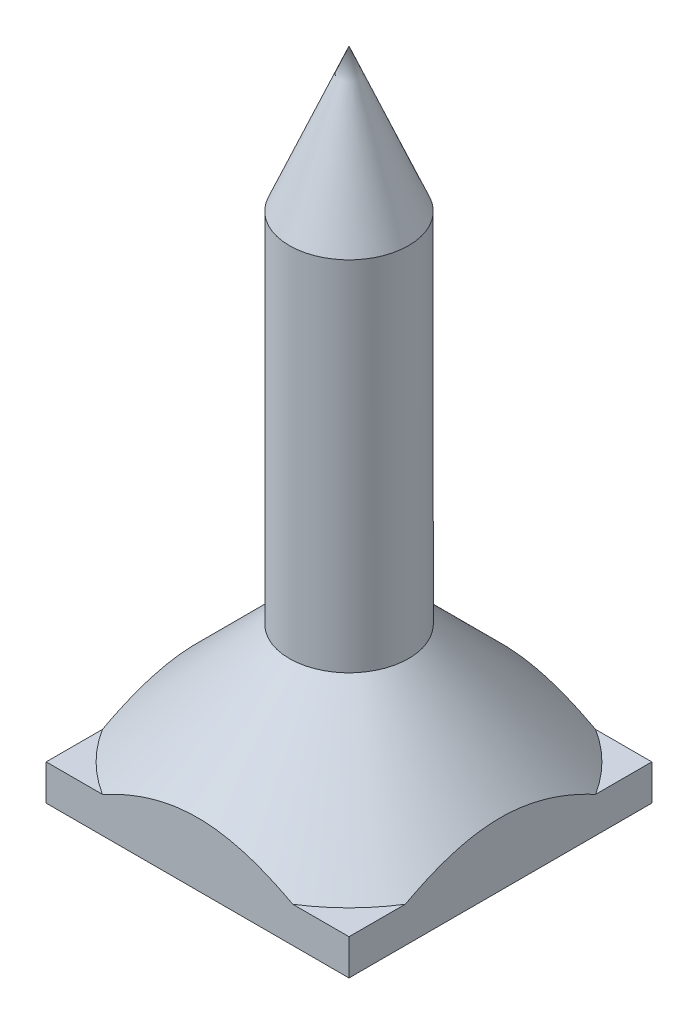
ISO-10303-21;
HEADER;
FILE_DESCRIPTION(('STEP AP214'),'2;1');
FILE_NAME('part.step','',(''),(''),'','','');
FILE_SCHEMA(('AUTOMOTIVE_DESIGN { 1 0 10303 214 1 1 1 1 }'));
ENDSEC;
DATA;
#1=APPLICATION_CONTEXT('core data for automotive mechanical design processes');
#2=APPLICATION_PROTOCOL_DEFINITION('international standard','automotive_design',2000,#1);
#3=PRODUCT_CONTEXT('',#1,'mechanical');
#4=PRODUCT('Part','Part','',(#3));
#5=PRODUCT_RELATED_PRODUCT_CATEGORY('part','',(#4));
#6=PRODUCT_DEFINITION_FORMATION('','',#4);
#7=PRODUCT_DEFINITION_CONTEXT('part definition',#1,'design');
#8=PRODUCT_DEFINITION('design','',#6,#7);
#9=PRODUCT_DEFINITION_SHAPE('','',#8);
#10=(LENGTH_UNIT() NAMED_UNIT(*) SI_UNIT(.MILLI.,.METRE.));
#11=(NAMED_UNIT(*) PLANE_ANGLE_UNIT() SI_UNIT($,.RADIAN.));
#12=(NAMED_UNIT(*) SI_UNIT($,.STERADIAN.) SOLID_ANGLE_UNIT());
#13=UNCERTAINTY_MEASURE_WITH_UNIT(LENGTH_MEASURE(1.E-05),#10,'distance_accuracy_value','');
#14=(GEOMETRIC_REPRESENTATION_CONTEXT(3) GLOBAL_UNCERTAINTY_ASSIGNED_CONTEXT((#13)) GLOBAL_UNIT_ASSIGNED_CONTEXT((#10,
#11,#12)) REPRESENTATION_CONTEXT('',''));
#15=CARTESIAN_POINT('',(0.,0.,0.));
#16=DIRECTION('',(0.,0.,1.));
#17=DIRECTION('',(1.,0.,0.));
#18=AXIS2_PLACEMENT_3D('',#15,#16,#17);
#19=CARTESIAN_POINT('',(0.,3.,0.));
#20=DIRECTION('',(0.,1.,0.));
#21=DIRECTION('',(0.,0.,1.));
#22=AXIS2_PLACEMENT_3D('',#19,#20,#21);
#23=PLANE('',#22);
#24=DIRECTION('',(0.,0.,1.));
#25=VECTOR('',#24,1.);
#26=CARTESIAN_POINT('',(-12.7,3.,-12.7));
#27=LINE('',#26,#25);
#28=CARTESIAN_POINT('',(-12.7,3.,-12.7));
#29=VERTEX_POINT('',#28);
#30=CARTESIAN_POINT('',(-12.7,3.,-7.98185442112309));
#31=VERTEX_POINT('',#30);
#32=EDGE_CURVE('E128',#29,#31,#27,.T.);
#33=ORIENTED_EDGE('',*,*,#32,.T.);
#34=CARTESIAN_POINT('',(0.,3.,0.));
#35=DIRECTION('',(0.,1.,0.));
#36=DIRECTION('',(0.,0.,1.));
#37=AXIS2_PLACEMENT_3D('',#34,#35,#36);
#38=CIRCLE('',#37,15.0000000000001);
#39=CARTESIAN_POINT('',(-7.98185442112309,3.,-12.7));
#40=VERTEX_POINT('',#39);
#41=EDGE_CURVE('E159',#31,#40,#38,.F.);
#42=ORIENTED_EDGE('',*,*,#41,.T.);
#43=DIRECTION('',(-1.,0.,0.));
#44=VECTOR('',#43,1.);
#45=CARTESIAN_POINT('',(-12.7,3.,-12.7));
#46=LINE('',#45,#44);
#47=EDGE_CURVE('E122',#40,#29,#46,.T.);
#48=ORIENTED_EDGE('',*,*,#47,.T.);
#49=EDGE_LOOP('',(#33,#42,#48));
#50=FACE_BOUND('',#49,.T.);
#51=ADVANCED_FACE('F35',(#50),#23,.T.);
#52=CARTESIAN_POINT('',(12.7,3.,-12.7));
#53=VERTEX_POINT('',#52);
#54=CARTESIAN_POINT('',(7.98185442112309,3.,-12.7));
#55=VERTEX_POINT('',#54);
#56=EDGE_CURVE('E124',#53,#55,#46,.T.);
#57=ORIENTED_EDGE('',*,*,#56,.T.);
#58=CARTESIAN_POINT('',(0.,3.,0.));
#59=DIRECTION('',(0.,1.,0.));
#60=DIRECTION('',(0.,0.,1.));
#61=AXIS2_PLACEMENT_3D('',#58,#59,#60);
#62=CIRCLE('',#61,15.0000000000001);
#63=CARTESIAN_POINT('',(12.7,3.,-7.98185442112309));
#64=VERTEX_POINT('',#63);
#65=EDGE_CURVE('E157',#55,#64,#62,.F.);
#66=ORIENTED_EDGE('',*,*,#65,.T.);
#67=DIRECTION('',(0.,0.,-1.));
#68=VECTOR('',#67,1.);
#69=CARTESIAN_POINT('',(12.7,3.,-12.7));
#70=LINE('',#69,#68);
#71=EDGE_CURVE('E123',#64,#53,#70,.T.);
#72=ORIENTED_EDGE('',*,*,#71,.T.);
#73=EDGE_LOOP('',(#57,#66,#72));
#74=FACE_BOUND('',#73,.T.);
#75=ADVANCED_FACE('F187',(#74),#23,.T.);
#76=CARTESIAN_POINT('',(12.7,3.,12.7));
#77=VERTEX_POINT('',#76);
#78=CARTESIAN_POINT('',(12.7,3.,7.98185442112309));
#79=VERTEX_POINT('',#78);
#80=EDGE_CURVE('E120',#77,#79,#70,.T.);
#81=ORIENTED_EDGE('',*,*,#80,.T.);
#82=CARTESIAN_POINT('',(0.,3.,0.));
#83=DIRECTION('',(0.,1.,0.));
#84=DIRECTION('',(0.,0.,1.));
#85=AXIS2_PLACEMENT_3D('',#82,#83,#84);
#86=CIRCLE('',#85,15.0000000000001);
#87=CARTESIAN_POINT('',(7.98185442112309,3.,12.7));
#88=VERTEX_POINT('',#87);
#89=EDGE_CURVE('E55',#79,#88,#86,.F.);
#90=ORIENTED_EDGE('',*,*,#89,.T.);
#91=DIRECTION('',(1.,0.,0.));
#92=VECTOR('',#91,1.);
#93=CARTESIAN_POINT('',(-12.7,3.,12.7));
#94=LINE('',#93,#92);
#95=EDGE_CURVE('E131',#88,#77,#94,.T.);
#96=ORIENTED_EDGE('',*,*,#95,.T.);
#97=EDGE_LOOP('',(#81,#90,#96));
#98=FACE_BOUND('',#97,.T.);
#99=ADVANCED_FACE('F182',(#98),#23,.T.);
#100=CARTESIAN_POINT('',(12.7,3.,-12.7));
#101=DIRECTION('',(-1.,0.,0.));
#102=DIRECTION('',(0.,0.,1.));
#103=AXIS2_PLACEMENT_3D('',#100,#101,#102);
#104=PLANE('',#103);
#105=DIRECTION('',(0.,0.,-1.));
#106=VECTOR('',#105,1.);
#107=CARTESIAN_POINT('',(12.7,0.,-12.7));
#108=LINE('',#107,#106);
#109=CARTESIAN_POINT('',(12.7,0.,12.7));
#110=VERTEX_POINT('',#109);
#111=CARTESIAN_POINT('',(12.7,0.,-12.7));
#112=VERTEX_POINT('',#111);
#113=EDGE_CURVE('E114',#110,#112,#108,.T.);
#114=ORIENTED_EDGE('',*,*,#113,.T.);
#115=DIRECTION('',(0.,-1.,0.));
#116=VECTOR('',#115,1.);
#117=CARTESIAN_POINT('',(12.7,3.,-12.7));
#118=LINE('',#117,#116);
#119=EDGE_CURVE('E148',#53,#112,#118,.T.);
#120=ORIENTED_EDGE('',*,*,#119,.F.);
#121=ORIENTED_EDGE('',*,*,#71,.F.);
#122=CARTESIAN_POINT('',(12.7,3.,-7.98185442112309));
#123=CARTESIAN_POINT('',(12.7,3.11879831329429,-7.75857118824416));
#124=CARTESIAN_POINT('',(12.7,3.23484506345829,-7.53380112802549));
#125=CARTESIAN_POINT('',(12.7,3.46065547637041,-7.08104367783081));
#126=CARTESIAN_POINT('',(12.7,3.57041717480403,-6.85305530946519));
#127=CARTESIAN_POINT('',(12.7,3.7832178072983,-6.3928583632601));
#128=CARTESIAN_POINT('',(12.7,3.88622878144904,-6.16063677124377));
#129=CARTESIAN_POINT('',(12.7,4.08407999046722,-5.69278426815837));
#130=CARTESIAN_POINT('',(12.7,4.17892091653303,-5.45715364747205));
#131=CARTESIAN_POINT('',(12.7,4.44859230245895,-4.7477448817082));
#132=CARTESIAN_POINT('',(12.7,4.60990459683797,-4.26862165573885));
#133=CARTESIAN_POINT('',(12.7,4.81773263879016,-3.54064768785785));
#134=CARTESIAN_POINT('',(12.7,4.88129100265066,-3.29658894276989));
#135=CARTESIAN_POINT('',(12.7,4.99598908895255,-2.8055824256638));
#136=CARTESIAN_POINT('',(12.7,5.04713021106923,-2.55863498255287));
#137=CARTESIAN_POINT('',(12.7,5.15862033107284,-1.93565738497596));
#138=CARTESIAN_POINT('',(12.7,5.21035977359975,-1.55803684516446));
#139=CARTESIAN_POINT('',(12.7,5.28045307895187,-0.79963762768062));
#140=CARTESIAN_POINT('',(12.7,5.29880286671081,-0.418858570220703));
#141=CARTESIAN_POINT('',(12.7,5.30108322360992,0.342788427278399));
#142=CARTESIAN_POINT('',(12.7,5.2850152362948,0.723656362919949));
#143=CARTESIAN_POINT('',(12.7,5.21936226932978,1.48241851629438));
#144=CARTESIAN_POINT('',(12.7,5.16978168115449,1.86031311708877));
#145=CARTESIAN_POINT('',(12.7,5.0611738448217,2.48690826118367));
#146=CARTESIAN_POINT('',(12.7,5.01064918014123,2.73713040569948));
#147=CARTESIAN_POINT('',(12.7,4.89678162829121,3.23465048566771));
#148=CARTESIAN_POINT('',(12.7,4.83343735818081,3.4819481025818));
#149=CARTESIAN_POINT('',(12.7,4.62568871144374,4.21959695807999));
#150=CARTESIAN_POINT('',(12.7,4.46368399317063,4.70506814729197));
#151=CARTESIAN_POINT('',(12.7,4.19207197317871,5.42389308709328));
#152=CARTESIAN_POINT('',(12.7,4.09639541647266,5.66272753112357));
#153=CARTESIAN_POINT('',(12.7,3.89662087872883,6.13689687966589));
#154=CARTESIAN_POINT('',(12.7,3.79252215091563,6.37223147165881));
#155=CARTESIAN_POINT('',(12.7,3.57735946998962,6.83850956482992));
#156=CARTESIAN_POINT('',(12.7,3.46632560661092,7.0694670448017));
#157=CARTESIAN_POINT('',(12.7,3.2378001426933,7.5280754952869));
#158=CARTESIAN_POINT('',(12.7,3.12031065229029,7.75572751584861));
#159=CARTESIAN_POINT('',(12.7,3.,7.98185442112309));
#160=B_SPLINE_CURVE_WITH_KNOTS('',3,(#122,#123,#124,#125,#126,#127,#128,#129,#130,#131,#132,
#133,#134,#135,#136,#137,#138,#139,#140,#141,#142,#143,#144,#145,#146,#147,#148,#149,#150,#151,
#152,#153,#154,#155,#156,#157,#158,#159),.UNSPECIFIED.,.F.,.F.,(4,2,2,2,2,2,2,2,2,2,2,2,2,2,2,2,
2,2,4),(0.,0.758768175132974,1.51777221376504,2.27974354303534,3.04165034494515,
4.55610413540643,5.31243480913123,6.06868018941063,7.21067700994502,8.35281319701983,
9.49490148174304,10.6368401367895,11.4023221009698,12.167886687124,13.7009468957227,
14.4727026044539,15.2445268182221,16.0132080396631,16.7816394816877),.UNSPECIFIED.);
#161=EDGE_CURVE('E168',#64,#79,#160,.T.);
#162=ORIENTED_EDGE('',*,*,#161,.T.);
#163=ORIENTED_EDGE('',*,*,#80,.F.);
#164=DIRECTION('',(0.,-1.,0.));
#165=VECTOR('',#164,1.);
#166=CARTESIAN_POINT('',(12.7,3.,12.7));
#167=LINE('',#166,#165);
#168=EDGE_CURVE('E133',#77,#110,#167,.T.);
#169=ORIENTED_EDGE('',*,*,#168,.T.);
#170=EDGE_LOOP('',(#114,#120,#121,#162,#163,#169));
#171=FACE_BOUND('',#170,.T.);
#172=ADVANCED_FACE('F176',(#171),#104,.F.);
#173=CARTESIAN_POINT('',(-12.7,3.,-12.7));
#174=DIRECTION('',(0.,0.,1.));
#175=DIRECTION('',(1.,0.,0.));
#176=AXIS2_PLACEMENT_3D('',#173,#174,#175);
#177=PLANE('',#176);
#178=DIRECTION('',(-1.,0.,0.));
#179=VECTOR('',#178,1.);
#180=CARTESIAN_POINT('',(-12.7,0.,-12.7));
#181=LINE('',#180,#179);
#182=CARTESIAN_POINT('',(-12.7,0.,-12.7));
#183=VERTEX_POINT('',#182);
#184=EDGE_CURVE('E117',#112,#183,#181,.T.);
#185=ORIENTED_EDGE('',*,*,#184,.T.);
#186=DIRECTION('',(0.,-1.,0.));
#187=VECTOR('',#186,1.);
#188=CARTESIAN_POINT('',(-12.7,3.,-12.7));
#189=LINE('',#188,#187);
#190=EDGE_CURVE('E145',#29,#183,#189,.T.);
#191=ORIENTED_EDGE('',*,*,#190,.F.);
#192=ORIENTED_EDGE('',*,*,#47,.F.);
#193=CARTESIAN_POINT('',(-7.98185442112309,3.,-12.7));
#194=CARTESIAN_POINT('',(-7.75857118824416,3.11879831329429,-12.7));
#195=CARTESIAN_POINT('',(-7.53380112802549,3.23484506345829,-12.7));
#196=CARTESIAN_POINT('',(-7.08104367783081,3.46065547637041,-12.7));
#197=CARTESIAN_POINT('',(-6.85305530946519,3.57041717480403,-12.7));
#198=CARTESIAN_POINT('',(-6.3928583632601,3.7832178072983,-12.7));
#199=CARTESIAN_POINT('',(-6.16063677124377,3.88622878144904,-12.7));
#200=CARTESIAN_POINT('',(-5.69278426815837,4.08407999046723,-12.7));
#201=CARTESIAN_POINT('',(-5.45715364747205,4.17892091653303,-12.7));
#202=CARTESIAN_POINT('',(-4.7477448817082,4.44859230245895,-12.7));
#203=CARTESIAN_POINT('',(-4.26862165573885,4.60990459683797,-12.7));
#204=CARTESIAN_POINT('',(-3.54064768785785,4.81773263879016,-12.7));
#205=CARTESIAN_POINT('',(-3.29658894276989,4.88129100265066,-12.7));
#206=CARTESIAN_POINT('',(-2.8055824256638,4.99598908895255,-12.7));
#207=CARTESIAN_POINT('',(-2.55863498255288,5.04713021106923,-12.7));
#208=CARTESIAN_POINT('',(-1.93565738497596,5.15862033107284,-12.7));
#209=CARTESIAN_POINT('',(-1.55803684516447,5.21035977359975,-12.7));
#210=CARTESIAN_POINT('',(-0.799637627680624,5.28045307895187,-12.7));
#211=CARTESIAN_POINT('',(-0.418858570220706,5.29880286671081,-12.7));
#212=CARTESIAN_POINT('',(0.342788427278396,5.30108322360993,-12.7));
#213=CARTESIAN_POINT('',(0.723656362919946,5.28501523629481,-12.7));
#214=CARTESIAN_POINT('',(1.48241851629438,5.21936226932978,-12.7));
#215=CARTESIAN_POINT('',(1.86031311708877,5.16978168115449,-12.7));
#216=CARTESIAN_POINT('',(2.48690826118367,5.0611738448217,-12.7));
#217=CARTESIAN_POINT('',(2.73713040569948,5.01064918014123,-12.7));
#218=CARTESIAN_POINT('',(3.23465048566771,4.89678162829121,-12.7));
#219=CARTESIAN_POINT('',(3.4819481025818,4.83343735818081,-12.7));
#220=CARTESIAN_POINT('',(4.21959695807999,4.62568871144374,-12.7));
#221=CARTESIAN_POINT('',(4.70506814729197,4.46368399317063,-12.7));
#222=CARTESIAN_POINT('',(5.42389308709328,4.19207197317871,-12.7));
#223=CARTESIAN_POINT('',(5.66272753112358,4.09639541647266,-12.7));
#224=CARTESIAN_POINT('',(6.1368968796659,3.89662087872883,-12.7));
#225=CARTESIAN_POINT('',(6.37223147165881,3.79252215091563,-12.7));
#226=CARTESIAN_POINT('',(6.83850956482993,3.57735946998962,-12.7));
#227=CARTESIAN_POINT('',(7.06946704480171,3.46632560661091,-12.7));
#228=CARTESIAN_POINT('',(7.5280754952869,3.2378001426933,-12.7));
#229=CARTESIAN_POINT('',(7.75572751584862,3.12031065229029,-12.7));
#230=CARTESIAN_POINT('',(7.98185442112309,3.,-12.7));
#231=B_SPLINE_CURVE_WITH_KNOTS('',3,(#193,#194,#195,#196,#197,#198,#199,#200,#201,#202,#203,
#204,#205,#206,#207,#208,#209,#210,#211,#212,#213,#214,#215,#216,#217,#218,#219,#220,#221,#222,
#223,#224,#225,#226,#227,#228,#229,#230),.UNSPECIFIED.,.F.,.F.,(4,2,2,2,2,2,2,2,2,2,2,2,2,2,2,2,
2,2,4),(0.,0.758768175132973,1.51777221376504,2.27974354303535,3.04165034494515,
4.55610413540643,5.31243480913123,6.06868018941063,7.21067700994501,8.35281319701983,
9.49490148174304,10.6368401367895,11.4023221009698,12.167886687124,13.7009468957227,
14.4727026044539,15.2445268182221,16.0132080396631,16.7816394816877),.UNSPECIFIED.);
#232=EDGE_CURVE('E162',#40,#55,#231,.T.);
#233=ORIENTED_EDGE('',*,*,#232,.T.);
#234=ORIENTED_EDGE('',*,*,#56,.F.);
#235=ORIENTED_EDGE('',*,*,#119,.T.);
#236=EDGE_LOOP('',(#185,#191,#192,#233,#234,#235));
#237=FACE_BOUND('',#236,.T.);
#238=ADVANCED_FACE('F172',(#237),#177,.F.);
#239=CARTESIAN_POINT('',(-12.7,3.,-12.7));
#240=DIRECTION('',(1.,0.,0.));
#241=DIRECTION('',(0.,0.,-1.));
#242=AXIS2_PLACEMENT_3D('',#239,#240,#241);
#243=PLANE('',#242);
#244=DIRECTION('',(0.,0.,1.));
#245=VECTOR('',#244,1.);
#246=CARTESIAN_POINT('',(-12.7,0.,-12.7));
#247=LINE('',#246,#245);
#248=CARTESIAN_POINT('',(-12.7,0.,12.7));
#249=VERTEX_POINT('',#248);
#250=EDGE_CURVE('E136',#183,#249,#247,.T.);
#251=ORIENTED_EDGE('',*,*,#250,.T.);
#252=DIRECTION('',(0.,-1.,0.));
#253=VECTOR('',#252,1.);
#254=CARTESIAN_POINT('',(-12.7,3.,12.7));
#255=LINE('',#254,#253);
#256=CARTESIAN_POINT('',(-12.7,3.,12.7));
#257=VERTEX_POINT('',#256);
#258=EDGE_CURVE('E142',#257,#249,#255,.T.);
#259=ORIENTED_EDGE('',*,*,#258,.F.);
#260=CARTESIAN_POINT('',(-12.7,3.,7.9818544211231));
#261=VERTEX_POINT('',#260);
#262=EDGE_CURVE('E127',#261,#257,#27,.T.);
#263=ORIENTED_EDGE('',*,*,#262,.F.);
#264=CARTESIAN_POINT('',(-12.7,3.,7.9818544211231));
#265=CARTESIAN_POINT('',(-12.7,3.1187983132943,7.75857118824417));
#266=CARTESIAN_POINT('',(-12.7,3.23484506345829,7.53380112802549));
#267=CARTESIAN_POINT('',(-12.7,3.46065547637041,7.08104367783081));
#268=CARTESIAN_POINT('',(-12.7,3.57041717480403,6.8530553094652));
#269=CARTESIAN_POINT('',(-12.7,3.7832178072983,6.3928583632601));
#270=CARTESIAN_POINT('',(-12.7,3.88622878144904,6.16063677124377));
#271=CARTESIAN_POINT('',(-12.7,4.08407999046723,5.69278426815837));
#272=CARTESIAN_POINT('',(-12.7,4.17892091653304,5.45715364747205));
#273=CARTESIAN_POINT('',(-12.7,4.44859230245895,4.74774488170821));
#274=CARTESIAN_POINT('',(-12.7,4.60990459683797,4.26862165573885));
#275=CARTESIAN_POINT('',(-12.7,4.81773263879017,3.54064768785785));
#276=CARTESIAN_POINT('',(-12.7,4.88129100265066,3.29658894276989));
#277=CARTESIAN_POINT('',(-12.7,4.99598908895255,2.8055824256638));
#278=CARTESIAN_POINT('',(-12.7,5.04713021106923,2.55863498255288));
#279=CARTESIAN_POINT('',(-12.7,5.15862033107284,1.93565738497596));
#280=CARTESIAN_POINT('',(-12.7,5.21035977359975,1.55803684516447));
#281=CARTESIAN_POINT('',(-12.7,5.28045307895187,0.799637627680623));
#282=CARTESIAN_POINT('',(-12.7,5.29880286671081,0.418858570220706));
#283=CARTESIAN_POINT('',(-12.7,5.30108322360993,-0.342788427278395));
#284=CARTESIAN_POINT('',(-12.7,5.28501523629481,-0.723656362919946));
#285=CARTESIAN_POINT('',(-12.7,5.21936226932978,-1.48241851629438));
#286=CARTESIAN_POINT('',(-12.7,5.1697816811545,-1.86031311708877));
#287=CARTESIAN_POINT('',(-12.7,5.06117384482171,-2.48690826118367));
#288=CARTESIAN_POINT('',(-12.7,5.01064918014123,-2.73713040569948));
#289=CARTESIAN_POINT('',(-12.7,4.89678162829121,-3.23465048566771));
#290=CARTESIAN_POINT('',(-12.7,4.83343735818081,-3.4819481025818));
#291=CARTESIAN_POINT('',(-12.7,4.62568871144374,-4.21959695807999));
#292=CARTESIAN_POINT('',(-12.7,4.46368399317063,-4.70506814729197));
#293=CARTESIAN_POINT('',(-12.7,4.19207197317871,-5.42389308709328));
#294=CARTESIAN_POINT('',(-12.7,4.09639541647266,-5.66272753112357));
#295=CARTESIAN_POINT('',(-12.7,3.89662087872883,-6.13689687966589));
#296=CARTESIAN_POINT('',(-12.7,3.79252215091563,-6.37223147165881));
#297=CARTESIAN_POINT('',(-12.7,3.57735946998962,-6.83850956482993));
#298=CARTESIAN_POINT('',(-12.7,3.46632560661092,-7.06946704480171));
#299=CARTESIAN_POINT('',(-12.7,3.2378001426933,-7.5280754952869));
#300=CARTESIAN_POINT('',(-12.7,3.12031065229029,-7.75572751584862));
#301=CARTESIAN_POINT('',(-12.7,3.,-7.98185442112309));
#302=B_SPLINE_CURVE_WITH_KNOTS('',3,(#264,#265,#266,#267,#268,#269,#270,#271,#272,#273,#274,
#275,#276,#277,#278,#279,#280,#281,#282,#283,#284,#285,#286,#287,#288,#289,#290,#291,#292,#293,
#294,#295,#296,#297,#298,#299,#300,#301),.UNSPECIFIED.,.F.,.F.,(4,2,2,2,2,2,2,2,2,2,2,2,2,2,2,2,
2,2,4),(0.,0.758768175132974,1.51777221376504,2.27974354303535,3.04165034494515,
4.55610413540643,5.31243480913124,6.06868018941063,7.21067700994502,8.35281319701983,
9.49490148174304,10.6368401367895,11.4023221009698,12.167886687124,13.7009468957227,
14.4727026044539,15.2445268182221,16.0132080396631,16.7816394816877),.UNSPECIFIED.);
#303=EDGE_CURVE('E11',#261,#31,#302,.T.);
#304=ORIENTED_EDGE('',*,*,#303,.T.);
#305=ORIENTED_EDGE('',*,*,#32,.F.);
#306=ORIENTED_EDGE('',*,*,#190,.T.);
#307=EDGE_LOOP('',(#251,#259,#263,#304,#305,#306));
#308=FACE_BOUND('',#307,.T.);
#309=ADVANCED_FACE('F175',(#308),#243,.F.);
#310=CARTESIAN_POINT('',(-12.7,3.,12.7));
#311=DIRECTION('',(0.,0.,-1.));
#312=DIRECTION('',(-1.,0.,0.));
#313=AXIS2_PLACEMENT_3D('',#310,#311,#312);
#314=PLANE('',#313);
#315=DIRECTION('',(1.,0.,0.));
#316=VECTOR('',#315,1.);
#317=CARTESIAN_POINT('',(-12.7,0.,12.7));
#318=LINE('',#317,#316);
#319=EDGE_CURVE('E138',#249,#110,#318,.T.);
#320=ORIENTED_EDGE('',*,*,#319,.T.);
#321=ORIENTED_EDGE('',*,*,#168,.F.);
#322=ORIENTED_EDGE('',*,*,#95,.F.);
#323=CARTESIAN_POINT('',(7.98185442112309,3.,12.7));
#324=CARTESIAN_POINT('',(7.75857118824416,3.11879831329429,12.7));
#325=CARTESIAN_POINT('',(7.53380112802549,3.23484506345829,12.7));
#326=CARTESIAN_POINT('',(7.08104367783081,3.46065547637041,12.7));
#327=CARTESIAN_POINT('',(6.85305530946519,3.57041717480403,12.7));
#328=CARTESIAN_POINT('',(6.3928583632601,3.7832178072983,12.7));
#329=CARTESIAN_POINT('',(6.16063677124377,3.88622878144904,12.7));
#330=CARTESIAN_POINT('',(5.69278426815837,4.08407999046723,12.7));
#331=CARTESIAN_POINT('',(5.45715364747205,4.17892091653303,12.7));
#332=CARTESIAN_POINT('',(4.7477448817082,4.44859230245895,12.7));
#333=CARTESIAN_POINT('',(4.26862165573885,4.60990459683797,12.7));
#334=CARTESIAN_POINT('',(3.54064768785785,4.81773263879016,12.7));
#335=CARTESIAN_POINT('',(3.29658894276989,4.88129100265066,12.7));
#336=CARTESIAN_POINT('',(2.8055824256638,4.99598908895255,12.7));
#337=CARTESIAN_POINT('',(2.55863498255288,5.04713021106923,12.7));
#338=CARTESIAN_POINT('',(1.93565738497596,5.15862033107284,12.7));
#339=CARTESIAN_POINT('',(1.55803684516447,5.21035977359975,12.7));
#340=CARTESIAN_POINT('',(0.799637627680624,5.28045307895187,12.7));
#341=CARTESIAN_POINT('',(0.418858570220706,5.29880286671081,12.7));
#342=CARTESIAN_POINT('',(-0.342788427278396,5.30108322360993,12.7));
#343=CARTESIAN_POINT('',(-0.723656362919946,5.28501523629481,12.7));
#344=CARTESIAN_POINT('',(-1.48241851629438,5.21936226932978,12.7));
#345=CARTESIAN_POINT('',(-1.86031311708877,5.16978168115449,12.7));
#346=CARTESIAN_POINT('',(-2.48690826118367,5.0611738448217,12.7));
#347=CARTESIAN_POINT('',(-2.73713040569948,5.01064918014123,12.7));
#348=CARTESIAN_POINT('',(-3.23465048566771,4.89678162829121,12.7));
#349=CARTESIAN_POINT('',(-3.4819481025818,4.83343735818081,12.7));
#350=CARTESIAN_POINT('',(-4.21959695807999,4.62568871144374,12.7));
#351=CARTESIAN_POINT('',(-4.70506814729197,4.46368399317063,12.7));
#352=CARTESIAN_POINT('',(-5.42389308709328,4.19207197317871,12.7));
#353=CARTESIAN_POINT('',(-5.66272753112358,4.09639541647266,12.7));
#354=CARTESIAN_POINT('',(-6.1368968796659,3.89662087872883,12.7));
#355=CARTESIAN_POINT('',(-6.37223147165881,3.79252215091563,12.7));
#356=CARTESIAN_POINT('',(-6.83850956482993,3.57735946998962,12.7));
#357=CARTESIAN_POINT('',(-7.06946704480171,3.46632560661091,12.7));
#358=CARTESIAN_POINT('',(-7.5280754952869,3.2378001426933,12.7));
#359=CARTESIAN_POINT('',(-7.75572751584862,3.12031065229029,12.7));
#360=CARTESIAN_POINT('',(-7.98185442112309,3.,12.7));
#361=B_SPLINE_CURVE_WITH_KNOTS('',3,(#323,#324,#325,#326,#327,#328,#329,#330,#331,#332,#333,
#334,#335,#336,#337,#338,#339,#340,#341,#342,#343,#344,#345,#346,#347,#348,#349,#350,#351,#352,
#353,#354,#355,#356,#357,#358,#359,#360),.UNSPECIFIED.,.F.,.F.,(4,2,2,2,2,2,2,2,2,2,2,2,2,2,2,2,
2,2,4),(0.,0.758768175132973,1.51777221376504,2.27974354303535,3.04165034494515,
4.55610413540643,5.31243480913123,6.06868018941063,7.21067700994501,8.35281319701983,
9.49490148174304,10.6368401367895,11.4023221009698,12.167886687124,13.7009468957227,
14.4727026044539,15.2445268182221,16.0132080396631,16.7816394816877),.UNSPECIFIED.);
#362=CARTESIAN_POINT('',(-7.98185442112309,3.,12.7));
#363=VERTEX_POINT('',#362);
#364=EDGE_CURVE('E48',#88,#363,#361,.T.);
#365=ORIENTED_EDGE('',*,*,#364,.T.);
#366=EDGE_CURVE('E132',#257,#363,#94,.T.);
#367=ORIENTED_EDGE('',*,*,#366,.F.);
#368=ORIENTED_EDGE('',*,*,#258,.T.);
#369=EDGE_LOOP('',(#320,#321,#322,#365,#367,#368));
#370=FACE_BOUND('',#369,.T.);
#371=ADVANCED_FACE('F200',(#370),#314,.F.);
#372=ORIENTED_EDGE('',*,*,#366,.T.);
#373=CARTESIAN_POINT('',(0.,3.,0.));
#374=DIRECTION('',(0.,1.,0.));
#375=DIRECTION('',(0.,0.,1.));
#376=AXIS2_PLACEMENT_3D('',#373,#374,#375);
#377=CIRCLE('',#376,15.0000000000001);
#378=EDGE_CURVE('E154',#363,#261,#377,.F.);
#379=ORIENTED_EDGE('',*,*,#378,.T.);
#380=ORIENTED_EDGE('',*,*,#262,.T.);
#381=EDGE_LOOP('',(#372,#379,#380));
#382=FACE_BOUND('',#381,.T.);
#383=ADVANCED_FACE('F189',(#382),#23,.T.);
#384=CARTESIAN_POINT('',(0.,0.,0.));
#385=DIRECTION('',(0.,1.,0.));
#386=DIRECTION('',(0.,0.,1.));
#387=AXIS2_PLACEMENT_3D('',#384,#385,#386);
#388=PLANE('',#387);
#389=ORIENTED_EDGE('',*,*,#113,.F.);
#390=ORIENTED_EDGE('',*,*,#319,.F.);
#391=ORIENTED_EDGE('',*,*,#250,.F.);
#392=ORIENTED_EDGE('',*,*,#184,.F.);
#393=EDGE_LOOP('',(#389,#390,#391,#392));
#394=FACE_BOUND('',#393,.T.);
#395=ADVANCED_FACE('F199',(#394),#388,.F.);
#396=CARTESIAN_POINT('',(0.,43.,0.));
#397=DIRECTION('',(0.,-1.,0.));
#398=DIRECTION('',(0.,0.,-1.));
#399=AXIS2_PLACEMENT_3D('',#396,#397,#398);
#400=CYLINDRICAL_SURFACE('',#399,5.);
#401=CARTESIAN_POINT('',(0.,13.0000000000002,0.));
#402=DIRECTION('',(0.,1.,0.));
#403=DIRECTION('',(0.,0.,1.));
#404=AXIS2_PLACEMENT_3D('',#401,#402,#403);
#405=CIRCLE('',#404,5.);
#406=CARTESIAN_POINT('',(0.,13.0000000000002,5.));
#407=VERTEX_POINT('',#406);
#408=EDGE_CURVE('E151',#407,#407,#405,.T.);
#409=ORIENTED_EDGE('',*,*,#408,.T.);
#410=EDGE_LOOP('',(#409));
#411=FACE_BOUND('',#410,.T.);
#412=CARTESIAN_POINT('',(0.,43.,0.));
#413=DIRECTION('',(0.,1.,0.));
#414=DIRECTION('',(0.,0.,1.));
#415=AXIS2_PLACEMENT_3D('',#412,#413,#414);
#416=CIRCLE('',#415,5.);
#417=CARTESIAN_POINT('',(0.,43.,5.));
#418=VERTEX_POINT('',#417);
#419=EDGE_CURVE('E112',#418,#418,#416,.T.);
#420=ORIENTED_EDGE('',*,*,#419,.F.);
#421=EDGE_LOOP('',(#420));
#422=FACE_BOUND('',#421,.T.);
#423=ADVANCED_FACE('F206',(#411,#422),#400,.T.);
#424=CARTESIAN_POINT('',(0.,13.0000000000002,0.));
#425=DIRECTION('',(0.,-1.,0.));
#426=DIRECTION('',(0.,0.,-1.));
#427=AXIS2_PLACEMENT_3D('',#424,#425,#426);
#428=CONICAL_SURFACE('',#427,5.,0.785398163397443);
#429=ORIENTED_EDGE('',*,*,#232,.F.);
#430=ORIENTED_EDGE('',*,*,#41,.F.);
#431=ORIENTED_EDGE('',*,*,#303,.F.);
#432=ORIENTED_EDGE('',*,*,#378,.F.);
#433=ORIENTED_EDGE('',*,*,#364,.F.);
#434=ORIENTED_EDGE('',*,*,#89,.F.);
#435=ORIENTED_EDGE('',*,*,#161,.F.);
#436=ORIENTED_EDGE('',*,*,#65,.F.);
#437=EDGE_LOOP('',(#429,#430,#431,#432,#433,#434,#435,#436));
#438=FACE_BOUND('',#437,.T.);
#439=ORIENTED_EDGE('',*,*,#408,.F.);
#440=EDGE_LOOP('',(#439));
#441=FACE_BOUND('',#440,.T.);
#442=ADVANCED_FACE('F37',(#438,#441),#428,.T.);
#443=CARTESIAN_POINT('',(0.,43.,0.));
#444=DIRECTION('',(0.,-1.,0.));
#445=DIRECTION('',(0.,0.,-1.));
#446=AXIS2_PLACEMENT_3D('',#443,#444,#445);
#447=CONICAL_SURFACE('',#446,5.,0.394791119699762);
#448=CARTESIAN_POINT('',(0.,55.,0.));
#449=VERTEX_POINT('',#448);
#450=VERTEX_LOOP('',#449);
#451=FACE_BOUND('',#450,.T.);
#452=ORIENTED_EDGE('',*,*,#419,.T.);
#453=EDGE_LOOP('',(#452));
#454=FACE_BOUND('',#453,.T.);
#455=ADVANCED_FACE('F106',(#451,#454),#447,.T.);
#456=CLOSED_SHELL('',(#51,#75,#99,#172,#238,#309,#371,#383,#395,#423,#442,#455));
#457=MANIFOLD_SOLID_BREP('B2',#456);
#458=ADVANCED_BREP_SHAPE_REPRESENTATION('',(#18,#457),#14);
#459=SHAPE_DEFINITION_REPRESENTATION(#9,#458);
ENDSEC;
END-ISO-10303-21;
